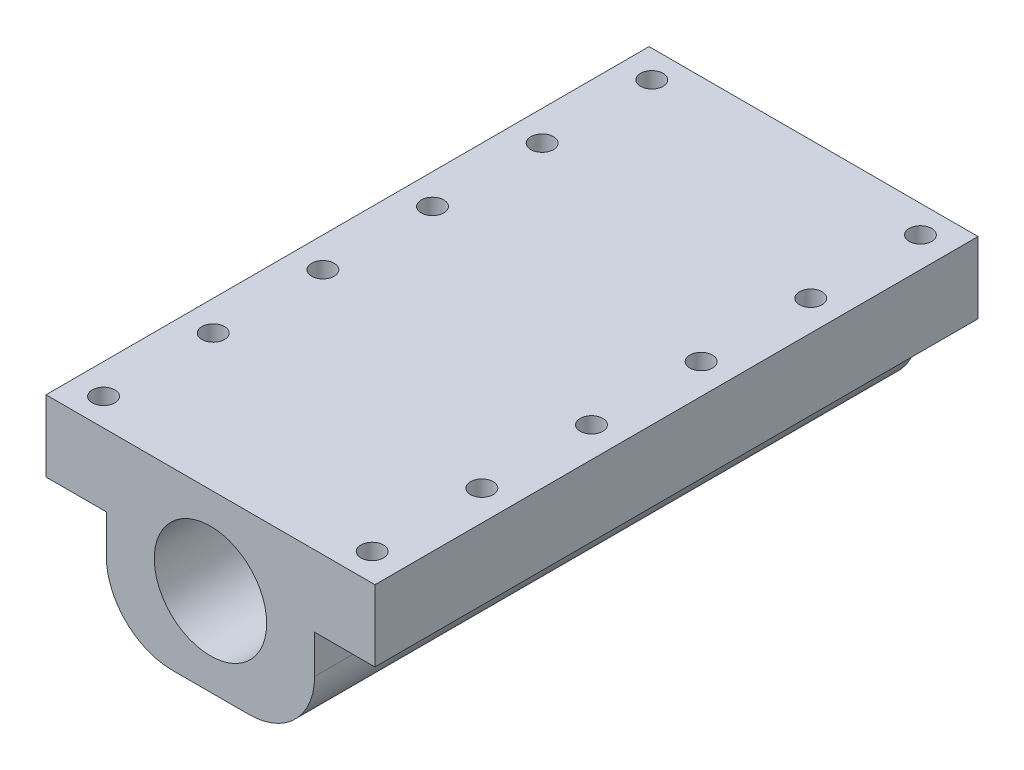
ISO-10303-21;
HEADER;
FILE_DESCRIPTION(('STEP AP214'),'2;1');
FILE_NAME('part.step','',(''),(''),'','','');
FILE_SCHEMA(('AUTOMOTIVE_DESIGN { 1 0 10303 214 1 1 1 1 }'));
ENDSEC;
DATA;
#1=APPLICATION_CONTEXT('core data for automotive mechanical design processes');
#2=APPLICATION_PROTOCOL_DEFINITION('international standard','automotive_design',2000,#1);
#3=PRODUCT_CONTEXT('',#1,'mechanical');
#4=PRODUCT('Part','Part','',(#3));
#5=PRODUCT_RELATED_PRODUCT_CATEGORY('part','',(#4));
#6=PRODUCT_DEFINITION_FORMATION('','',#4);
#7=PRODUCT_DEFINITION_CONTEXT('part definition',#1,'design');
#8=PRODUCT_DEFINITION('design','',#6,#7);
#9=PRODUCT_DEFINITION_SHAPE('','',#8);
#10=(LENGTH_UNIT() NAMED_UNIT(*) SI_UNIT(.MILLI.,.METRE.));
#11=(NAMED_UNIT(*) PLANE_ANGLE_UNIT() SI_UNIT($,.RADIAN.));
#12=(NAMED_UNIT(*) SI_UNIT($,.STERADIAN.) SOLID_ANGLE_UNIT());
#13=UNCERTAINTY_MEASURE_WITH_UNIT(LENGTH_MEASURE(1.E-05),#10,'distance_accuracy_value','');
#14=(GEOMETRIC_REPRESENTATION_CONTEXT(3) GLOBAL_UNCERTAINTY_ASSIGNED_CONTEXT((#13)) GLOBAL_UNIT_ASSIGNED_CONTEXT((#10,
#11,#12)) REPRESENTATION_CONTEXT('',''));
#15=CARTESIAN_POINT('',(0.,0.,0.));
#16=DIRECTION('',(0.,0.,1.));
#17=DIRECTION('',(1.,0.,0.));
#18=AXIS2_PLACEMENT_3D('',#15,#16,#17);
#19=CARTESIAN_POINT('',(-7.,-4.,110.));
#20=DIRECTION('',(0.,0.,1.));
#21=DIRECTION('',(1.,0.,0.));
#22=AXIS2_PLACEMENT_3D('',#19,#20,#21);
#23=PLANE('',#22);
#24=DIRECTION('',(0.,-1.,0.));
#25=VECTOR('',#24,1.);
#26=CARTESIAN_POINT('',(-30.,16.,110.));
#27=LINE('',#26,#25);
#28=CARTESIAN_POINT('',(-30.,16.,110.));
#29=VERTEX_POINT('',#28);
#30=CARTESIAN_POINT('',(-30.,3.,110.));
#31=VERTEX_POINT('',#30);
#32=EDGE_CURVE('E165',#29,#31,#27,.T.);
#33=ORIENTED_EDGE('',*,*,#32,.T.);
#34=DIRECTION('',(1.,0.,0.));
#35=VECTOR('',#34,1.);
#36=CARTESIAN_POINT('',(-30.,3.,110.));
#37=LINE('',#36,#35);
#38=CARTESIAN_POINT('',(-19.,3.,110.));
#39=VERTEX_POINT('',#38);
#40=EDGE_CURVE('E103',#31,#39,#37,.T.);
#41=ORIENTED_EDGE('',*,*,#40,.T.);
#42=DIRECTION('',(0.,-1.,0.));
#43=VECTOR('',#42,1.);
#44=CARTESIAN_POINT('',(-19.,3.,110.));
#45=LINE('',#44,#43);
#46=CARTESIAN_POINT('',(-19.,-4.,110.));
#47=VERTEX_POINT('',#46);
#48=EDGE_CURVE('E186',#39,#47,#45,.T.);
#49=ORIENTED_EDGE('',*,*,#48,.T.);
#50=CARTESIAN_POINT('',(-7.,-4.,110.));
#51=DIRECTION('',(0.,0.,1.));
#52=DIRECTION('',(1.,0.,0.));
#53=AXIS2_PLACEMENT_3D('',#50,#51,#52);
#54=CIRCLE('',#53,12.);
#55=CARTESIAN_POINT('',(-7.,-16.,110.));
#56=VERTEX_POINT('',#55);
#57=EDGE_CURVE('E205',#47,#56,#54,.T.);
#58=ORIENTED_EDGE('',*,*,#57,.T.);
#59=DIRECTION('',(1.,0.,0.));
#60=VECTOR('',#59,1.);
#61=CARTESIAN_POINT('',(-7.,-16.,110.));
#62=LINE('',#61,#60);
#63=CARTESIAN_POINT('',(7.,-16.,110.));
#64=VERTEX_POINT('',#63);
#65=EDGE_CURVE('E202',#56,#64,#62,.T.);
#66=ORIENTED_EDGE('',*,*,#65,.T.);
#67=CARTESIAN_POINT('',(7.,-4.,110.));
#68=DIRECTION('',(0.,0.,1.));
#69=DIRECTION('',(-1.,0.,0.));
#70=AXIS2_PLACEMENT_3D('',#67,#68,#69);
#71=CIRCLE('',#70,12.);
#72=CARTESIAN_POINT('',(19.,-4.,110.));
#73=VERTEX_POINT('',#72);
#74=EDGE_CURVE('E204',#64,#73,#71,.T.);
#75=ORIENTED_EDGE('',*,*,#74,.T.);
#76=DIRECTION('',(0.,1.,0.));
#77=VECTOR('',#76,1.);
#78=CARTESIAN_POINT('',(19.,3.,110.));
#79=LINE('',#78,#77);
#80=CARTESIAN_POINT('',(19.,3.,110.));
#81=VERTEX_POINT('',#80);
#82=EDGE_CURVE('E128',#73,#81,#79,.T.);
#83=ORIENTED_EDGE('',*,*,#82,.T.);
#84=DIRECTION('',(1.,0.,0.));
#85=VECTOR('',#84,1.);
#86=CARTESIAN_POINT('',(30.,3.,110.));
#87=LINE('',#86,#85);
#88=CARTESIAN_POINT('',(30.,3.,110.));
#89=VERTEX_POINT('',#88);
#90=EDGE_CURVE('E122',#81,#89,#87,.T.);
#91=ORIENTED_EDGE('',*,*,#90,.T.);
#92=DIRECTION('',(0.,1.,0.));
#93=VECTOR('',#92,1.);
#94=CARTESIAN_POINT('',(30.,16.,110.));
#95=LINE('',#94,#93);
#96=CARTESIAN_POINT('',(30.,16.,110.));
#97=VERTEX_POINT('',#96);
#98=EDGE_CURVE('E126',#89,#97,#95,.T.);
#99=ORIENTED_EDGE('',*,*,#98,.T.);
#100=DIRECTION('',(-1.,0.,0.));
#101=VECTOR('',#100,1.);
#102=CARTESIAN_POINT('',(30.,16.,110.));
#103=LINE('',#102,#101);
#104=EDGE_CURVE('E54',#97,#29,#103,.T.);
#105=ORIENTED_EDGE('',*,*,#104,.T.);
#106=EDGE_LOOP('',(#33,#41,#49,#58,#66,#75,#83,#91,#99,#105));
#107=FACE_BOUND('',#106,.T.);
#108=CARTESIAN_POINT('',(0.,0.,110.));
#109=DIRECTION('',(0.,0.,1.));
#110=DIRECTION('',(1.,0.,0.));
#111=AXIS2_PLACEMENT_3D('',#108,#109,#110);
#112=CIRCLE('',#111,10.25);
#113=CARTESIAN_POINT('',(10.25,0.,110.));
#114=VERTEX_POINT('',#113);
#115=EDGE_CURVE('E150',#114,#114,#112,.T.);
#116=ORIENTED_EDGE('',*,*,#115,.F.);
#117=EDGE_LOOP('',(#116));
#118=FACE_BOUND('',#117,.T.);
#119=ADVANCED_FACE('F37',(#107,#118),#23,.T.);
#120=CARTESIAN_POINT('',(-7.,-4.,0.));
#121=DIRECTION('',(0.,0.,1.));
#122=DIRECTION('',(1.,0.,0.));
#123=AXIS2_PLACEMENT_3D('',#120,#121,#122);
#124=PLANE('',#123);
#125=DIRECTION('',(0.,-1.,0.));
#126=VECTOR('',#125,1.);
#127=CARTESIAN_POINT('',(-30.,16.,0.));
#128=LINE('',#127,#126);
#129=CARTESIAN_POINT('',(-30.,16.,0.));
#130=VERTEX_POINT('',#129);
#131=CARTESIAN_POINT('',(-30.,3.,0.));
#132=VERTEX_POINT('',#131);
#133=EDGE_CURVE('E146',#130,#132,#128,.T.);
#134=ORIENTED_EDGE('',*,*,#133,.F.);
#135=DIRECTION('',(-1.,0.,0.));
#136=VECTOR('',#135,1.);
#137=CARTESIAN_POINT('',(30.,16.,0.));
#138=LINE('',#137,#136);
#139=CARTESIAN_POINT('',(30.,16.,0.));
#140=VERTEX_POINT('',#139);
#141=EDGE_CURVE('E95',#140,#130,#138,.T.);
#142=ORIENTED_EDGE('',*,*,#141,.F.);
#143=DIRECTION('',(0.,1.,0.));
#144=VECTOR('',#143,1.);
#145=CARTESIAN_POINT('',(30.,16.,0.));
#146=LINE('',#145,#144);
#147=CARTESIAN_POINT('',(30.,3.,0.));
#148=VERTEX_POINT('',#147);
#149=EDGE_CURVE('E89',#148,#140,#146,.T.);
#150=ORIENTED_EDGE('',*,*,#149,.F.);
#151=DIRECTION('',(1.,0.,0.));
#152=VECTOR('',#151,1.);
#153=CARTESIAN_POINT('',(30.,3.,0.));
#154=LINE('',#153,#152);
#155=CARTESIAN_POINT('',(19.,3.,0.));
#156=VERTEX_POINT('',#155);
#157=EDGE_CURVE('E136',#156,#148,#154,.T.);
#158=ORIENTED_EDGE('',*,*,#157,.F.);
#159=DIRECTION('',(0.,1.,0.));
#160=VECTOR('',#159,1.);
#161=CARTESIAN_POINT('',(19.,3.,0.));
#162=LINE('',#161,#160);
#163=CARTESIAN_POINT('',(19.,-4.,0.));
#164=VERTEX_POINT('',#163);
#165=EDGE_CURVE('E160',#164,#156,#162,.T.);
#166=ORIENTED_EDGE('',*,*,#165,.F.);
#167=CARTESIAN_POINT('',(7.,-4.,0.));
#168=DIRECTION('',(0.,0.,1.));
#169=DIRECTION('',(-1.,0.,0.));
#170=AXIS2_PLACEMENT_3D('',#167,#168,#169);
#171=CIRCLE('',#170,12.);
#172=CARTESIAN_POINT('',(7.,-16.,0.));
#173=VERTEX_POINT('',#172);
#174=EDGE_CURVE('E158',#173,#164,#171,.T.);
#175=ORIENTED_EDGE('',*,*,#174,.F.);
#176=DIRECTION('',(1.,0.,0.));
#177=VECTOR('',#176,1.);
#178=CARTESIAN_POINT('',(-7.,-16.,0.));
#179=LINE('',#178,#177);
#180=CARTESIAN_POINT('',(-7.,-16.,0.));
#181=VERTEX_POINT('',#180);
#182=EDGE_CURVE('E156',#181,#173,#179,.T.);
#183=ORIENTED_EDGE('',*,*,#182,.F.);
#184=CARTESIAN_POINT('',(-7.,-4.,0.));
#185=DIRECTION('',(0.,0.,1.));
#186=DIRECTION('',(1.,0.,0.));
#187=AXIS2_PLACEMENT_3D('',#184,#185,#186);
#188=CIRCLE('',#187,12.);
#189=CARTESIAN_POINT('',(-19.,-4.,0.));
#190=VERTEX_POINT('',#189);
#191=EDGE_CURVE('E154',#190,#181,#188,.T.);
#192=ORIENTED_EDGE('',*,*,#191,.F.);
#193=DIRECTION('',(0.,-1.,0.));
#194=VECTOR('',#193,1.);
#195=CARTESIAN_POINT('',(-19.,3.,0.));
#196=LINE('',#195,#194);
#197=CARTESIAN_POINT('',(-19.,3.,0.));
#198=VERTEX_POINT('',#197);
#199=EDGE_CURVE('E152',#198,#190,#196,.T.);
#200=ORIENTED_EDGE('',*,*,#199,.F.);
#201=DIRECTION('',(1.,0.,0.));
#202=VECTOR('',#201,1.);
#203=CARTESIAN_POINT('',(-30.,3.,0.));
#204=LINE('',#203,#202);
#205=EDGE_CURVE('E149',#132,#198,#204,.T.);
#206=ORIENTED_EDGE('',*,*,#205,.F.);
#207=EDGE_LOOP('',(#134,#142,#150,#158,#166,#175,#183,#192,#200,#206));
#208=FACE_BOUND('',#207,.T.);
#209=CARTESIAN_POINT('',(0.,0.,0.));
#210=DIRECTION('',(0.,0.,1.));
#211=DIRECTION('',(1.,0.,0.));
#212=AXIS2_PLACEMENT_3D('',#209,#210,#211);
#213=CIRCLE('',#212,10.25);
#214=CARTESIAN_POINT('',(10.25,0.,0.));
#215=VERTEX_POINT('',#214);
#216=EDGE_CURVE('E213',#215,#215,#213,.T.);
#217=ORIENTED_EDGE('',*,*,#216,.T.);
#218=EDGE_LOOP('',(#217));
#219=FACE_BOUND('',#218,.T.);
#220=ADVANCED_FACE('F190',(#208,#219),#124,.F.);
#221=CARTESIAN_POINT('',(-30.,16.,110.));
#222=DIRECTION('',(1.,0.,0.));
#223=DIRECTION('',(0.,1.,0.));
#224=AXIS2_PLACEMENT_3D('',#221,#222,#223);
#225=PLANE('',#224);
#226=ORIENTED_EDGE('',*,*,#133,.T.);
#227=DIRECTION('',(0.,0.,-1.));
#228=VECTOR('',#227,1.);
#229=CARTESIAN_POINT('',(-30.,3.,110.));
#230=LINE('',#229,#228);
#231=EDGE_CURVE('E11',#31,#132,#230,.T.);
#232=ORIENTED_EDGE('',*,*,#231,.F.);
#233=ORIENTED_EDGE('',*,*,#32,.F.);
#234=DIRECTION('',(0.,0.,-1.));
#235=VECTOR('',#234,1.);
#236=CARTESIAN_POINT('',(-30.,16.,110.));
#237=LINE('',#236,#235);
#238=EDGE_CURVE('E142',#29,#130,#237,.T.);
#239=ORIENTED_EDGE('',*,*,#238,.T.);
#240=EDGE_LOOP('',(#226,#232,#233,#239));
#241=FACE_BOUND('',#240,.T.);
#242=ADVANCED_FACE('F39',(#241),#225,.F.);
#243=CARTESIAN_POINT('',(-30.,3.,110.));
#244=DIRECTION('',(0.,1.,0.));
#245=DIRECTION('',(0.,0.,1.));
#246=AXIS2_PLACEMENT_3D('',#243,#244,#245);
#247=PLANE('',#246);
#248=CARTESIAN_POINT('',(-24.4999999999988,3.,4.99999999999998));
#249=DIRECTION('',(0.,-1.,0.));
#250=DIRECTION('',(0.,0.,-1.));
#251=AXIS2_PLACEMENT_3D('',#248,#249,#250);
#252=CIRCLE('',#251,2.06);
#253=CARTESIAN_POINT('',(-24.4999999999988,3.,2.93999999999997));
#254=VERTEX_POINT('',#253);
#255=EDGE_CURVE('E260',#254,#254,#252,.T.);
#256=ORIENTED_EDGE('',*,*,#255,.F.);
#257=EDGE_LOOP('',(#256));
#258=FACE_BOUND('',#257,.T.);
#259=CARTESIAN_POINT('',(-24.499999999999,3.,25.));
#260=DIRECTION('',(0.,-1.,0.));
#261=DIRECTION('',(0.,0.,-1.));
#262=AXIS2_PLACEMENT_3D('',#259,#260,#261);
#263=CIRCLE('',#262,2.06);
#264=CARTESIAN_POINT('',(-24.499999999999,3.,22.94));
#265=VERTEX_POINT('',#264);
#266=EDGE_CURVE('E266',#265,#265,#263,.T.);
#267=ORIENTED_EDGE('',*,*,#266,.F.);
#268=EDGE_LOOP('',(#267));
#269=FACE_BOUND('',#268,.T.);
#270=CARTESIAN_POINT('',(-24.4999999999992,3.,45.));
#271=DIRECTION('',(0.,-1.,0.));
#272=DIRECTION('',(0.,0.,-1.));
#273=AXIS2_PLACEMENT_3D('',#270,#271,#272);
#274=CIRCLE('',#273,2.06);
#275=CARTESIAN_POINT('',(-24.4999999999992,3.,42.94));
#276=VERTEX_POINT('',#275);
#277=EDGE_CURVE('E229',#276,#276,#274,.T.);
#278=ORIENTED_EDGE('',*,*,#277,.F.);
#279=EDGE_LOOP('',(#278));
#280=FACE_BOUND('',#279,.T.);
#281=CARTESIAN_POINT('',(-24.4999999999994,3.,65.));
#282=DIRECTION('',(0.,-1.,0.));
#283=DIRECTION('',(0.,0.,-1.));
#284=AXIS2_PLACEMENT_3D('',#281,#282,#283);
#285=CIRCLE('',#284,2.06);
#286=CARTESIAN_POINT('',(-24.4999999999994,3.,62.94));
#287=VERTEX_POINT('',#286);
#288=EDGE_CURVE('E228',#287,#287,#285,.T.);
#289=ORIENTED_EDGE('',*,*,#288,.F.);
#290=EDGE_LOOP('',(#289));
#291=FACE_BOUND('',#290,.T.);
#292=CARTESIAN_POINT('',(-24.4999999999996,3.,85.));
#293=DIRECTION('',(0.,-1.,0.));
#294=DIRECTION('',(0.,0.,-1.));
#295=AXIS2_PLACEMENT_3D('',#292,#293,#294);
#296=CIRCLE('',#295,2.06000000000001);
#297=CARTESIAN_POINT('',(-24.4999999999996,3.,82.94));
#298=VERTEX_POINT('',#297);
#299=EDGE_CURVE('E236',#298,#298,#296,.T.);
#300=ORIENTED_EDGE('',*,*,#299,.F.);
#301=EDGE_LOOP('',(#300));
#302=FACE_BOUND('',#301,.T.);
#303=CARTESIAN_POINT('',(-24.4999999999998,3.,105.));
#304=DIRECTION('',(0.,-1.,0.));
#305=DIRECTION('',(0.,0.,-1.));
#306=AXIS2_PLACEMENT_3D('',#303,#304,#305);
#307=CIRCLE('',#306,2.06);
#308=CARTESIAN_POINT('',(-24.4999999999998,3.,102.94));
#309=VERTEX_POINT('',#308);
#310=EDGE_CURVE('E242',#309,#309,#307,.T.);
#311=ORIENTED_EDGE('',*,*,#310,.F.);
#312=EDGE_LOOP('',(#311));
#313=FACE_BOUND('',#312,.T.);
#314=ORIENTED_EDGE('',*,*,#205,.T.);
#315=DIRECTION('',(0.,0.,-1.));
#316=VECTOR('',#315,1.);
#317=CARTESIAN_POINT('',(-19.,3.,110.));
#318=LINE('',#317,#316);
#319=EDGE_CURVE('E46',#39,#198,#318,.T.);
#320=ORIENTED_EDGE('',*,*,#319,.F.);
#321=ORIENTED_EDGE('',*,*,#40,.F.);
#322=ORIENTED_EDGE('',*,*,#231,.T.);
#323=EDGE_LOOP('',(#314,#320,#321,#322));
#324=FACE_BOUND('',#323,.T.);
#325=ADVANCED_FACE('F500',(#258,#269,#280,#291,#302,#313,#324),#247,.F.);
#326=CARTESIAN_POINT('',(-19.,3.,110.));
#327=DIRECTION('',(1.,0.,0.));
#328=DIRECTION('',(0.,1.,0.));
#329=AXIS2_PLACEMENT_3D('',#326,#327,#328);
#330=PLANE('',#329);
#331=ORIENTED_EDGE('',*,*,#199,.T.);
#332=DIRECTION('',(0.,0.,-1.));
#333=VECTOR('',#332,1.);
#334=CARTESIAN_POINT('',(-19.,-4.,110.));
#335=LINE('',#334,#333);
#336=EDGE_CURVE('E178',#47,#190,#335,.T.);
#337=ORIENTED_EDGE('',*,*,#336,.F.);
#338=ORIENTED_EDGE('',*,*,#48,.F.);
#339=ORIENTED_EDGE('',*,*,#319,.T.);
#340=EDGE_LOOP('',(#331,#337,#338,#339));
#341=FACE_BOUND('',#340,.T.);
#342=ADVANCED_FACE('F184',(#341),#330,.F.);
#343=CARTESIAN_POINT('',(-7.,-4.,110.));
#344=DIRECTION('',(0.,0.,-1.));
#345=DIRECTION('',(-1.,0.,0.));
#346=AXIS2_PLACEMENT_3D('',#343,#344,#345);
#347=CYLINDRICAL_SURFACE('',#346,12.);
#348=ORIENTED_EDGE('',*,*,#191,.T.);
#349=DIRECTION('',(0.,0.,-1.));
#350=VECTOR('',#349,1.);
#351=CARTESIAN_POINT('',(-7.,-16.,110.));
#352=LINE('',#351,#350);
#353=EDGE_CURVE('E175',#56,#181,#352,.T.);
#354=ORIENTED_EDGE('',*,*,#353,.F.);
#355=ORIENTED_EDGE('',*,*,#57,.F.);
#356=ORIENTED_EDGE('',*,*,#336,.T.);
#357=EDGE_LOOP('',(#348,#354,#355,#356));
#358=FACE_BOUND('',#357,.T.);
#359=ADVANCED_FACE('F196',(#358),#347,.T.);
#360=CARTESIAN_POINT('',(-7.,-16.,110.));
#361=DIRECTION('',(0.,1.,0.));
#362=DIRECTION('',(0.,0.,1.));
#363=AXIS2_PLACEMENT_3D('',#360,#361,#362);
#364=PLANE('',#363);
#365=ORIENTED_EDGE('',*,*,#182,.T.);
#366=DIRECTION('',(0.,0.,-1.));
#367=VECTOR('',#366,1.);
#368=CARTESIAN_POINT('',(7.,-16.,110.));
#369=LINE('',#368,#367);
#370=EDGE_CURVE('E172',#64,#173,#369,.T.);
#371=ORIENTED_EDGE('',*,*,#370,.F.);
#372=ORIENTED_EDGE('',*,*,#65,.F.);
#373=ORIENTED_EDGE('',*,*,#353,.T.);
#374=EDGE_LOOP('',(#365,#371,#372,#373));
#375=FACE_BOUND('',#374,.T.);
#376=ADVANCED_FACE('F200',(#375),#364,.F.);
#377=CARTESIAN_POINT('',(7.,-4.,110.));
#378=DIRECTION('',(0.,0.,-1.));
#379=DIRECTION('',(-1.,0.,0.));
#380=AXIS2_PLACEMENT_3D('',#377,#378,#379);
#381=CYLINDRICAL_SURFACE('',#380,12.);
#382=ORIENTED_EDGE('',*,*,#174,.T.);
#383=DIRECTION('',(0.,0.,-1.));
#384=VECTOR('',#383,1.);
#385=CARTESIAN_POINT('',(19.,-4.,110.));
#386=LINE('',#385,#384);
#387=EDGE_CURVE('E169',#73,#164,#386,.T.);
#388=ORIENTED_EDGE('',*,*,#387,.F.);
#389=ORIENTED_EDGE('',*,*,#74,.F.);
#390=ORIENTED_EDGE('',*,*,#370,.T.);
#391=EDGE_LOOP('',(#382,#388,#389,#390));
#392=FACE_BOUND('',#391,.T.);
#393=ADVANCED_FACE('F469',(#392),#381,.T.);
#394=CARTESIAN_POINT('',(19.,3.,110.));
#395=DIRECTION('',(-1.,0.,0.));
#396=DIRECTION('',(0.,-1.,0.));
#397=AXIS2_PLACEMENT_3D('',#394,#395,#396);
#398=PLANE('',#397);
#399=ORIENTED_EDGE('',*,*,#165,.T.);
#400=DIRECTION('',(0.,0.,-1.));
#401=VECTOR('',#400,1.);
#402=CARTESIAN_POINT('',(19.,3.,110.));
#403=LINE('',#402,#401);
#404=EDGE_CURVE('E137',#81,#156,#403,.T.);
#405=ORIENTED_EDGE('',*,*,#404,.F.);
#406=ORIENTED_EDGE('',*,*,#82,.F.);
#407=ORIENTED_EDGE('',*,*,#387,.T.);
#408=EDGE_LOOP('',(#399,#405,#406,#407));
#409=FACE_BOUND('',#408,.T.);
#410=ADVANCED_FACE('F296',(#409),#398,.F.);
#411=CARTESIAN_POINT('',(30.,3.,110.));
#412=DIRECTION('',(0.,1.,0.));
#413=DIRECTION('',(0.,0.,1.));
#414=AXIS2_PLACEMENT_3D('',#411,#412,#413);
#415=PLANE('',#414);
#416=CARTESIAN_POINT('',(24.4999999999992,3.,45.));
#417=DIRECTION('',(0.,-1.,0.));
#418=DIRECTION('',(0.,0.,1.));
#419=AXIS2_PLACEMENT_3D('',#416,#417,#418);
#420=CIRCLE('',#419,2.06);
#421=CARTESIAN_POINT('',(24.4999999999992,3.,47.06));
#422=VERTEX_POINT('',#421);
#423=EDGE_CURVE('E253',#422,#422,#420,.T.);
#424=ORIENTED_EDGE('',*,*,#423,.F.);
#425=EDGE_LOOP('',(#424));
#426=FACE_BOUND('',#425,.T.);
#427=CARTESIAN_POINT('',(24.499999999999,3.,25.));
#428=DIRECTION('',(0.,-1.,0.));
#429=DIRECTION('',(0.,0.,1.));
#430=AXIS2_PLACEMENT_3D('',#427,#428,#429);
#431=CIRCLE('',#430,2.06);
#432=CARTESIAN_POINT('',(24.499999999999,3.,27.06));
#433=VERTEX_POINT('',#432);
#434=EDGE_CURVE('E252',#433,#433,#431,.T.);
#435=ORIENTED_EDGE('',*,*,#434,.F.);
#436=EDGE_LOOP('',(#435));
#437=FACE_BOUND('',#436,.T.);
#438=CARTESIAN_POINT('',(24.4999999999994,3.,65.));
#439=DIRECTION('',(0.,-1.,0.));
#440=DIRECTION('',(0.,0.,1.));
#441=AXIS2_PLACEMENT_3D('',#438,#439,#440);
#442=CIRCLE('',#441,2.06);
#443=CARTESIAN_POINT('',(24.4999999999994,3.,67.06));
#444=VERTEX_POINT('',#443);
#445=EDGE_CURVE('E283',#444,#444,#442,.T.);
#446=ORIENTED_EDGE('',*,*,#445,.F.);
#447=EDGE_LOOP('',(#446));
#448=FACE_BOUND('',#447,.T.);
#449=CARTESIAN_POINT('',(24.4999999999996,3.,85.));
#450=DIRECTION('',(0.,-1.,0.));
#451=DIRECTION('',(0.,0.,1.));
#452=AXIS2_PLACEMENT_3D('',#449,#450,#451);
#453=CIRCLE('',#452,2.06000000000001);
#454=CARTESIAN_POINT('',(24.4999999999996,3.,87.06));
#455=VERTEX_POINT('',#454);
#456=EDGE_CURVE('E276',#455,#455,#453,.T.);
#457=ORIENTED_EDGE('',*,*,#456,.F.);
#458=EDGE_LOOP('',(#457));
#459=FACE_BOUND('',#458,.T.);
#460=CARTESIAN_POINT('',(24.4999999999998,3.,105.));
#461=DIRECTION('',(0.,-1.,0.));
#462=DIRECTION('',(0.,0.,1.));
#463=AXIS2_PLACEMENT_3D('',#460,#461,#462);
#464=CIRCLE('',#463,2.06);
#465=CARTESIAN_POINT('',(24.4999999999998,3.,107.06));
#466=VERTEX_POINT('',#465);
#467=EDGE_CURVE('E277',#466,#466,#464,.T.);
#468=ORIENTED_EDGE('',*,*,#467,.F.);
#469=EDGE_LOOP('',(#468));
#470=FACE_BOUND('',#469,.T.);
#471=CARTESIAN_POINT('',(24.4999999999988,3.,4.99999999999998));
#472=DIRECTION('',(0.,-1.,0.));
#473=DIRECTION('',(0.,0.,1.));
#474=AXIS2_PLACEMENT_3D('',#471,#472,#473);
#475=CIRCLE('',#474,2.06);
#476=CARTESIAN_POINT('',(24.4999999999988,3.,7.05999999999998));
#477=VERTEX_POINT('',#476);
#478=EDGE_CURVE('E221',#477,#477,#475,.T.);
#479=ORIENTED_EDGE('',*,*,#478,.F.);
#480=EDGE_LOOP('',(#479));
#481=FACE_BOUND('',#480,.T.);
#482=ORIENTED_EDGE('',*,*,#157,.T.);
#483=DIRECTION('',(0.,0.,-1.));
#484=VECTOR('',#483,1.);
#485=CARTESIAN_POINT('',(30.,3.,110.));
#486=LINE('',#485,#484);
#487=EDGE_CURVE('E133',#89,#148,#486,.T.);
#488=ORIENTED_EDGE('',*,*,#487,.F.);
#489=ORIENTED_EDGE('',*,*,#90,.F.);
#490=ORIENTED_EDGE('',*,*,#404,.T.);
#491=EDGE_LOOP('',(#482,#488,#489,#490));
#492=FACE_BOUND('',#491,.T.);
#493=ADVANCED_FACE('F134',(#426,#437,#448,#459,#470,#481,#492),#415,.F.);
#494=CARTESIAN_POINT('',(30.,16.,110.));
#495=DIRECTION('',(-1.,0.,0.));
#496=DIRECTION('',(0.,-1.,0.));
#497=AXIS2_PLACEMENT_3D('',#494,#495,#496);
#498=PLANE('',#497);
#499=ORIENTED_EDGE('',*,*,#149,.T.);
#500=DIRECTION('',(0.,0.,-1.));
#501=VECTOR('',#500,1.);
#502=CARTESIAN_POINT('',(30.,16.,110.));
#503=LINE('',#502,#501);
#504=EDGE_CURVE('E138',#97,#140,#503,.T.);
#505=ORIENTED_EDGE('',*,*,#504,.F.);
#506=ORIENTED_EDGE('',*,*,#98,.F.);
#507=ORIENTED_EDGE('',*,*,#487,.T.);
#508=EDGE_LOOP('',(#499,#505,#506,#507));
#509=FACE_BOUND('',#508,.T.);
#510=ADVANCED_FACE('F140',(#509),#498,.F.);
#511=CARTESIAN_POINT('',(30.,16.,110.));
#512=DIRECTION('',(0.,-1.,0.));
#513=DIRECTION('',(0.,0.,-1.));
#514=AXIS2_PLACEMENT_3D('',#511,#512,#513);
#515=PLANE('',#514);
#516=CARTESIAN_POINT('',(24.4999999999992,16.,45.));
#517=DIRECTION('',(0.,-1.,0.));
#518=DIRECTION('',(0.,0.,-1.));
#519=AXIS2_PLACEMENT_3D('',#516,#517,#518);
#520=CIRCLE('',#519,2.06);
#521=CARTESIAN_POINT('',(24.4999999999992,16.,42.94));
#522=VERTEX_POINT('',#521);
#523=EDGE_CURVE('E249',#522,#522,#520,.F.);
#524=ORIENTED_EDGE('',*,*,#523,.F.);
#525=EDGE_LOOP('',(#524));
#526=FACE_BOUND('',#525,.T.);
#527=CARTESIAN_POINT('',(24.499999999999,16.,25.));
#528=DIRECTION('',(0.,-1.,0.));
#529=DIRECTION('',(0.,0.,-1.));
#530=AXIS2_PLACEMENT_3D('',#527,#528,#529);
#531=CIRCLE('',#530,2.06);
#532=CARTESIAN_POINT('',(24.499999999999,16.,22.94));
#533=VERTEX_POINT('',#532);
#534=EDGE_CURVE('E257',#533,#533,#531,.F.);
#535=ORIENTED_EDGE('',*,*,#534,.F.);
#536=EDGE_LOOP('',(#535));
#537=FACE_BOUND('',#536,.T.);
#538=CARTESIAN_POINT('',(-24.4999999999988,16.,4.99999999999998));
#539=DIRECTION('',(0.,-1.,0.));
#540=DIRECTION('',(0.,0.,-1.));
#541=AXIS2_PLACEMENT_3D('',#538,#539,#540);
#542=CIRCLE('',#541,2.06);
#543=CARTESIAN_POINT('',(-24.4999999999988,16.,2.93999999999997));
#544=VERTEX_POINT('',#543);
#545=EDGE_CURVE('E263',#544,#544,#542,.F.);
#546=ORIENTED_EDGE('',*,*,#545,.F.);
#547=EDGE_LOOP('',(#546));
#548=FACE_BOUND('',#547,.T.);
#549=CARTESIAN_POINT('',(-24.499999999999,16.,25.));
#550=DIRECTION('',(0.,-1.,0.));
#551=DIRECTION('',(0.,0.,-1.));
#552=AXIS2_PLACEMENT_3D('',#549,#550,#551);
#553=CIRCLE('',#552,2.06);
#554=CARTESIAN_POINT('',(-24.499999999999,16.,22.94));
#555=VERTEX_POINT('',#554);
#556=EDGE_CURVE('E232',#555,#555,#553,.F.);
#557=ORIENTED_EDGE('',*,*,#556,.F.);
#558=EDGE_LOOP('',(#557));
#559=FACE_BOUND('',#558,.T.);
#560=CARTESIAN_POINT('',(-24.4999999999992,16.,45.));
#561=DIRECTION('',(0.,-1.,0.));
#562=DIRECTION('',(0.,0.,-1.));
#563=AXIS2_PLACEMENT_3D('',#560,#561,#562);
#564=CIRCLE('',#563,2.06);
#565=CARTESIAN_POINT('',(-24.4999999999992,16.,42.94));
#566=VERTEX_POINT('',#565);
#567=EDGE_CURVE('E225',#566,#566,#564,.F.);
#568=ORIENTED_EDGE('',*,*,#567,.F.);
#569=EDGE_LOOP('',(#568));
#570=FACE_BOUND('',#569,.T.);
#571=CARTESIAN_POINT('',(-24.4999999999994,16.,65.));
#572=DIRECTION('',(0.,-1.,0.));
#573=DIRECTION('',(0.,0.,-1.));
#574=AXIS2_PLACEMENT_3D('',#571,#572,#573);
#575=CIRCLE('',#574,2.06);
#576=CARTESIAN_POINT('',(-24.4999999999994,16.,62.94));
#577=VERTEX_POINT('',#576);
#578=EDGE_CURVE('E233',#577,#577,#575,.F.);
#579=ORIENTED_EDGE('',*,*,#578,.F.);
#580=EDGE_LOOP('',(#579));
#581=FACE_BOUND('',#580,.T.);
#582=CARTESIAN_POINT('',(-24.4999999999996,16.,85.));
#583=DIRECTION('',(0.,-1.,0.));
#584=DIRECTION('',(0.,0.,-1.));
#585=AXIS2_PLACEMENT_3D('',#582,#583,#584);
#586=CIRCLE('',#585,2.06000000000001);
#587=CARTESIAN_POINT('',(-24.4999999999996,16.,82.94));
#588=VERTEX_POINT('',#587);
#589=EDGE_CURVE('E239',#588,#588,#586,.F.);
#590=ORIENTED_EDGE('',*,*,#589,.F.);
#591=EDGE_LOOP('',(#590));
#592=FACE_BOUND('',#591,.T.);
#593=CARTESIAN_POINT('',(-24.4999999999998,16.,105.));
#594=DIRECTION('',(0.,-1.,0.));
#595=DIRECTION('',(0.,0.,-1.));
#596=AXIS2_PLACEMENT_3D('',#593,#594,#595);
#597=CIRCLE('',#596,2.06);
#598=CARTESIAN_POINT('',(-24.4999999999998,16.,102.94));
#599=VERTEX_POINT('',#598);
#600=EDGE_CURVE('E224',#599,#599,#597,.F.);
#601=ORIENTED_EDGE('',*,*,#600,.F.);
#602=EDGE_LOOP('',(#601));
#603=FACE_BOUND('',#602,.T.);
#604=CARTESIAN_POINT('',(24.4999999999994,16.,65.));
#605=DIRECTION('',(0.,-1.,0.));
#606=DIRECTION('',(0.,0.,-1.));
#607=AXIS2_PLACEMENT_3D('',#604,#605,#606);
#608=CIRCLE('',#607,2.06);
#609=CARTESIAN_POINT('',(24.4999999999994,16.,62.94));
#610=VERTEX_POINT('',#609);
#611=EDGE_CURVE('E256',#610,#610,#608,.F.);
#612=ORIENTED_EDGE('',*,*,#611,.F.);
#613=EDGE_LOOP('',(#612));
#614=FACE_BOUND('',#613,.T.);
#615=CARTESIAN_POINT('',(24.4999999999996,16.,85.));
#616=DIRECTION('',(0.,-1.,0.));
#617=DIRECTION('',(0.,0.,-1.));
#618=AXIS2_PLACEMENT_3D('',#615,#616,#617);
#619=CIRCLE('',#618,2.06000000000001);
#620=CARTESIAN_POINT('',(24.4999999999996,16.,82.94));
#621=VERTEX_POINT('',#620);
#622=EDGE_CURVE('E280',#621,#621,#619,.F.);
#623=ORIENTED_EDGE('',*,*,#622,.F.);
#624=EDGE_LOOP('',(#623));
#625=FACE_BOUND('',#624,.T.);
#626=CARTESIAN_POINT('',(24.4999999999998,16.,105.));
#627=DIRECTION('',(0.,-1.,0.));
#628=DIRECTION('',(0.,0.,-1.));
#629=AXIS2_PLACEMENT_3D('',#626,#627,#628);
#630=CIRCLE('',#629,2.06);
#631=CARTESIAN_POINT('',(24.4999999999998,16.,102.94));
#632=VERTEX_POINT('',#631);
#633=EDGE_CURVE('E273',#632,#632,#630,.F.);
#634=ORIENTED_EDGE('',*,*,#633,.F.);
#635=EDGE_LOOP('',(#634));
#636=FACE_BOUND('',#635,.T.);
#637=CARTESIAN_POINT('',(24.4999999999988,16.,4.99999999999998));
#638=DIRECTION('',(0.,-1.,0.));
#639=DIRECTION('',(0.,0.,-1.));
#640=AXIS2_PLACEMENT_3D('',#637,#638,#639);
#641=CIRCLE('',#640,2.06);
#642=CARTESIAN_POINT('',(24.4999999999988,16.,2.93999999999997));
#643=VERTEX_POINT('',#642);
#644=EDGE_CURVE('E216',#643,#643,#641,.F.);
#645=ORIENTED_EDGE('',*,*,#644,.F.);
#646=EDGE_LOOP('',(#645));
#647=FACE_BOUND('',#646,.T.);
#648=ORIENTED_EDGE('',*,*,#141,.T.);
#649=ORIENTED_EDGE('',*,*,#238,.F.);
#650=ORIENTED_EDGE('',*,*,#104,.F.);
#651=ORIENTED_EDGE('',*,*,#504,.T.);
#652=EDGE_LOOP('',(#648,#649,#650,#651));
#653=FACE_BOUND('',#652,.T.);
#654=ADVANCED_FACE('F313',(#526,#537,#548,#559,#570,#581,#592,#603,#614,#625,#636,#647,#653),
#515,.F.);
#655=CARTESIAN_POINT('',(0.,0.,110.));
#656=DIRECTION('',(0.,0.,-1.));
#657=DIRECTION('',(-1.,0.,0.));
#658=AXIS2_PLACEMENT_3D('',#655,#656,#657);
#659=CYLINDRICAL_SURFACE('',#658,10.25);
#660=ORIENTED_EDGE('',*,*,#115,.T.);
#661=EDGE_LOOP('',(#660));
#662=FACE_BOUND('',#661,.T.);
#663=ORIENTED_EDGE('',*,*,#216,.F.);
#664=EDGE_LOOP('',(#663));
#665=FACE_BOUND('',#664,.T.);
#666=ADVANCED_FACE('F309',(#662,#665),#659,.F.);
#667=CARTESIAN_POINT('',(24.4999999999988,16.001,4.99999999999998));
#668=DIRECTION('',(0.,-1.,0.));
#669=DIRECTION('',(0.,0.,-1.));
#670=AXIS2_PLACEMENT_3D('',#667,#668,#669);
#671=CYLINDRICAL_SURFACE('',#670,2.06);
#672=ORIENTED_EDGE('',*,*,#478,.T.);
#673=EDGE_LOOP('',(#672));
#674=FACE_BOUND('',#673,.T.);
#675=ORIENTED_EDGE('',*,*,#644,.T.);
#676=EDGE_LOOP('',(#675));
#677=FACE_BOUND('',#676,.T.);
#678=ADVANCED_FACE('F305',(#674,#677),#671,.F.);
#679=CARTESIAN_POINT('',(24.4999999999998,16.001,105.));
#680=DIRECTION('',(0.,-1.,0.));
#681=DIRECTION('',(0.,0.,-1.));
#682=AXIS2_PLACEMENT_3D('',#679,#680,#681);
#683=CYLINDRICAL_SURFACE('',#682,2.06);
#684=ORIENTED_EDGE('',*,*,#467,.T.);
#685=EDGE_LOOP('',(#684));
#686=FACE_BOUND('',#685,.T.);
#687=ORIENTED_EDGE('',*,*,#633,.T.);
#688=EDGE_LOOP('',(#687));
#689=FACE_BOUND('',#688,.T.);
#690=ADVANCED_FACE('F308',(#686,#689),#683,.F.);
#691=CARTESIAN_POINT('',(24.4999999999996,16.001,85.));
#692=DIRECTION('',(0.,-1.,0.));
#693=DIRECTION('',(0.,0.,-1.));
#694=AXIS2_PLACEMENT_3D('',#691,#692,#693);
#695=CYLINDRICAL_SURFACE('',#694,2.06000000000001);
#696=ORIENTED_EDGE('',*,*,#456,.T.);
#697=EDGE_LOOP('',(#696));
#698=FACE_BOUND('',#697,.T.);
#699=ORIENTED_EDGE('',*,*,#622,.T.);
#700=EDGE_LOOP('',(#699));
#701=FACE_BOUND('',#700,.T.);
#702=ADVANCED_FACE('F367',(#698,#701),#695,.F.);
#703=CARTESIAN_POINT('',(24.4999999999994,16.001,65.));
#704=DIRECTION('',(0.,-1.,0.));
#705=DIRECTION('',(0.,0.,-1.));
#706=AXIS2_PLACEMENT_3D('',#703,#704,#705);
#707=CYLINDRICAL_SURFACE('',#706,2.06);
#708=ORIENTED_EDGE('',*,*,#445,.T.);
#709=EDGE_LOOP('',(#708));
#710=FACE_BOUND('',#709,.T.);
#711=ORIENTED_EDGE('',*,*,#611,.T.);
#712=EDGE_LOOP('',(#711));
#713=FACE_BOUND('',#712,.T.);
#714=ADVANCED_FACE('F291',(#710,#713),#707,.F.);
#715=CARTESIAN_POINT('',(-24.4999999999998,16.001,105.));
#716=DIRECTION('',(0.,-1.,0.));
#717=DIRECTION('',(0.,0.,-1.));
#718=AXIS2_PLACEMENT_3D('',#715,#716,#717);
#719=CYLINDRICAL_SURFACE('',#718,2.06);
#720=ORIENTED_EDGE('',*,*,#310,.T.);
#721=EDGE_LOOP('',(#720));
#722=FACE_BOUND('',#721,.T.);
#723=ORIENTED_EDGE('',*,*,#600,.T.);
#724=EDGE_LOOP('',(#723));
#725=FACE_BOUND('',#724,.T.);
#726=ADVANCED_FACE('F345',(#722,#725),#719,.F.);
#727=CARTESIAN_POINT('',(-24.4999999999996,16.001,85.));
#728=DIRECTION('',(0.,-1.,0.));
#729=DIRECTION('',(0.,0.,-1.));
#730=AXIS2_PLACEMENT_3D('',#727,#728,#729);
#731=CYLINDRICAL_SURFACE('',#730,2.06000000000001);
#732=ORIENTED_EDGE('',*,*,#299,.T.);
#733=EDGE_LOOP('',(#732));
#734=FACE_BOUND('',#733,.T.);
#735=ORIENTED_EDGE('',*,*,#589,.T.);
#736=EDGE_LOOP('',(#735));
#737=FACE_BOUND('',#736,.T.);
#738=ADVANCED_FACE('F341',(#734,#737),#731,.F.);
#739=CARTESIAN_POINT('',(-24.4999999999994,16.001,65.));
#740=DIRECTION('',(0.,-1.,0.));
#741=DIRECTION('',(0.,0.,-1.));
#742=AXIS2_PLACEMENT_3D('',#739,#740,#741);
#743=CYLINDRICAL_SURFACE('',#742,2.06);
#744=ORIENTED_EDGE('',*,*,#288,.T.);
#745=EDGE_LOOP('',(#744));
#746=FACE_BOUND('',#745,.T.);
#747=ORIENTED_EDGE('',*,*,#578,.T.);
#748=EDGE_LOOP('',(#747));
#749=FACE_BOUND('',#748,.T.);
#750=ADVANCED_FACE('F337',(#746,#749),#743,.F.);
#751=CARTESIAN_POINT('',(-24.4999999999992,16.001,45.));
#752=DIRECTION('',(0.,-1.,0.));
#753=DIRECTION('',(0.,0.,-1.));
#754=AXIS2_PLACEMENT_3D('',#751,#752,#753);
#755=CYLINDRICAL_SURFACE('',#754,2.06);
#756=ORIENTED_EDGE('',*,*,#277,.T.);
#757=EDGE_LOOP('',(#756));
#758=FACE_BOUND('',#757,.T.);
#759=ORIENTED_EDGE('',*,*,#567,.T.);
#760=EDGE_LOOP('',(#759));
#761=FACE_BOUND('',#760,.T.);
#762=ADVANCED_FACE('F333',(#758,#761),#755,.F.);
#763=CARTESIAN_POINT('',(-24.499999999999,16.001,25.));
#764=DIRECTION('',(0.,-1.,0.));
#765=DIRECTION('',(0.,0.,-1.));
#766=AXIS2_PLACEMENT_3D('',#763,#764,#765);
#767=CYLINDRICAL_SURFACE('',#766,2.06);
#768=ORIENTED_EDGE('',*,*,#266,.T.);
#769=EDGE_LOOP('',(#768));
#770=FACE_BOUND('',#769,.T.);
#771=ORIENTED_EDGE('',*,*,#556,.T.);
#772=EDGE_LOOP('',(#771));
#773=FACE_BOUND('',#772,.T.);
#774=ADVANCED_FACE('F336',(#770,#773),#767,.F.);
#775=CARTESIAN_POINT('',(-24.4999999999988,16.001,4.99999999999998));
#776=DIRECTION('',(0.,-1.,0.));
#777=DIRECTION('',(0.,0.,-1.));
#778=AXIS2_PLACEMENT_3D('',#775,#776,#777);
#779=CYLINDRICAL_SURFACE('',#778,2.06);
#780=ORIENTED_EDGE('',*,*,#255,.T.);
#781=EDGE_LOOP('',(#780));
#782=FACE_BOUND('',#781,.T.);
#783=ORIENTED_EDGE('',*,*,#545,.T.);
#784=EDGE_LOOP('',(#783));
#785=FACE_BOUND('',#784,.T.);
#786=ADVANCED_FACE('F357',(#782,#785),#779,.F.);
#787=CARTESIAN_POINT('',(24.499999999999,16.001,25.));
#788=DIRECTION('',(0.,-1.,0.));
#789=DIRECTION('',(0.,0.,-1.));
#790=AXIS2_PLACEMENT_3D('',#787,#788,#789);
#791=CYLINDRICAL_SURFACE('',#790,2.06);
#792=ORIENTED_EDGE('',*,*,#434,.T.);
#793=EDGE_LOOP('',(#792));
#794=FACE_BOUND('',#793,.T.);
#795=ORIENTED_EDGE('',*,*,#534,.T.);
#796=EDGE_LOOP('',(#795));
#797=FACE_BOUND('',#796,.T.);
#798=ADVANCED_FACE('F353',(#794,#797),#791,.F.);
#799=CARTESIAN_POINT('',(24.4999999999992,16.001,45.));
#800=DIRECTION('',(0.,-1.,0.));
#801=DIRECTION('',(0.,0.,-1.));
#802=AXIS2_PLACEMENT_3D('',#799,#800,#801);
#803=CYLINDRICAL_SURFACE('',#802,2.06);
#804=ORIENTED_EDGE('',*,*,#423,.T.);
#805=EDGE_LOOP('',(#804));
#806=FACE_BOUND('',#805,.T.);
#807=ORIENTED_EDGE('',*,*,#523,.T.);
#808=EDGE_LOOP('',(#807));
#809=FACE_BOUND('',#808,.T.);
#810=ADVANCED_FACE('F350',(#806,#809),#803,.F.);
#811=CLOSED_SHELL('',(#119,#220,#242,#325,#342,#359,#376,#393,#410,#493,#510,#654,#666,#678,
#690,#702,#714,#726,#738,#750,#762,#774,#786,#798,#810));
#812=MANIFOLD_SOLID_BREP('B2',#811);
#813=ADVANCED_BREP_SHAPE_REPRESENTATION('',(#18,#812),#14);
#814=SHAPE_DEFINITION_REPRESENTATION(#9,#813);
ENDSEC;
END-ISO-10303-21;
